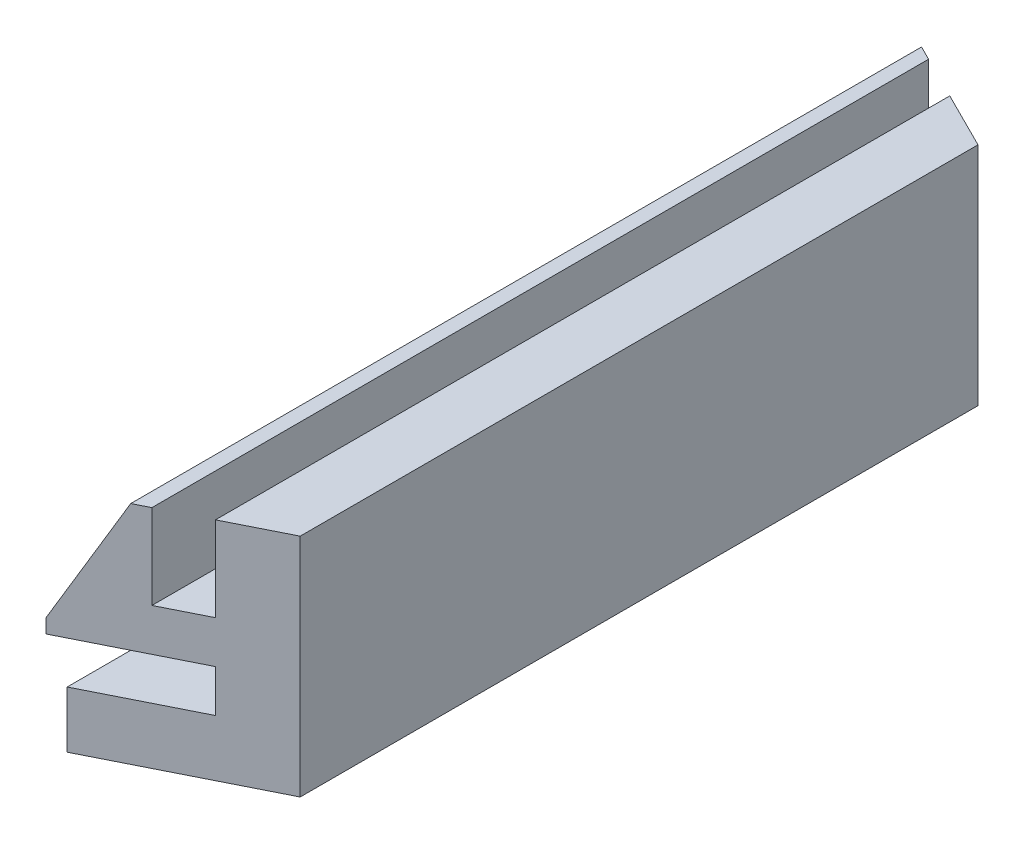
ISO-10303-21;
HEADER;
FILE_DESCRIPTION(('STEP AP214'),'2;1');
FILE_NAME('part.step','',(''),(''),'','','');
FILE_SCHEMA(('AUTOMOTIVE_DESIGN { 1 0 10303 214 1 1 1 1 }'));
ENDSEC;
DATA;
#1=APPLICATION_CONTEXT('core data for automotive mechanical design processes');
#2=APPLICATION_PROTOCOL_DEFINITION('international standard','automotive_design',2000,#1);
#3=PRODUCT_CONTEXT('',#1,'mechanical');
#4=PRODUCT('Part','Part','',(#3));
#5=PRODUCT_RELATED_PRODUCT_CATEGORY('part','',(#4));
#6=PRODUCT_DEFINITION_FORMATION('','',#4);
#7=PRODUCT_DEFINITION_CONTEXT('part definition',#1,'design');
#8=PRODUCT_DEFINITION('design','',#6,#7);
#9=PRODUCT_DEFINITION_SHAPE('','',#8);
#10=(LENGTH_UNIT() NAMED_UNIT(*) SI_UNIT(.MILLI.,.METRE.));
#11=(NAMED_UNIT(*) PLANE_ANGLE_UNIT() SI_UNIT($,.RADIAN.));
#12=(NAMED_UNIT(*) SI_UNIT($,.STERADIAN.) SOLID_ANGLE_UNIT());
#13=UNCERTAINTY_MEASURE_WITH_UNIT(LENGTH_MEASURE(1.E-05),#10,'distance_accuracy_value','');
#14=(GEOMETRIC_REPRESENTATION_CONTEXT(3) GLOBAL_UNCERTAINTY_ASSIGNED_CONTEXT((#13)) GLOBAL_UNIT_ASSIGNED_CONTEXT((#10,
#11,#12)) REPRESENTATION_CONTEXT('',''));
#15=CARTESIAN_POINT('',(0.,0.,0.));
#16=DIRECTION('',(0.,0.,1.));
#17=DIRECTION('',(1.,0.,0.));
#18=AXIS2_PLACEMENT_3D('',#15,#16,#17);
#19=CARTESIAN_POINT('',(24.0957258346277,-4.00000000000002,48.1810473352916));
#20=DIRECTION('',(0.447290848418714,0.,0.894388560370081));
#21=DIRECTION('',(0.894388560370081,0.,-0.447290848418714));
#22=AXIS2_PLACEMENT_3D('',#19,#20,#21);
#23=PLANE('',#22);
#24=DIRECTION('',(0.894388560370081,0.,-0.447290848418714));
#25=VECTOR('',#24,1.);
#26=CARTESIAN_POINT('',(24.0957258346277,12.,48.1810473352916));
#27=LINE('',#26,#25);
#28=CARTESIAN_POINT('',(0.,12.,60.2315118977807));
#29=VERTEX_POINT('',#28);
#30=CARTESIAN_POINT('',(4.,12.,58.2310800128576));
#31=VERTEX_POINT('',#30);
#32=EDGE_CURVE('E246',#29,#31,#27,.T.);
#33=ORIENTED_EDGE('',*,*,#32,.F.);
#34=DIRECTION('',(0.,-1.,0.));
#35=VECTOR('',#34,1.);
#36=CARTESIAN_POINT('',(0.,12.,60.2315118977807));
#37=LINE('',#36,#35);
#38=CARTESIAN_POINT('',(0.,6.,60.2315118977807));
#39=VERTEX_POINT('',#38);
#40=EDGE_CURVE('E243',#29,#39,#37,.T.);
#41=ORIENTED_EDGE('',*,*,#40,.T.);
#42=DIRECTION('',(-0.894388560370081,0.,0.447290848418714));
#43=VECTOR('',#42,1.);
#44=CARTESIAN_POINT('',(-3.90790142424717,6.,62.1858845508309));
#45=LINE('',#44,#43);
#46=CARTESIAN_POINT('',(-3.,6.,61.7318358114731));
#47=VERTEX_POINT('',#46);
#48=EDGE_CURVE('E275',#39,#47,#45,.T.);
#49=ORIENTED_EDGE('',*,*,#48,.T.);
#50=DIRECTION('',(0.,1.,0.));
#51=VECTOR('',#50,1.);
#52=CARTESIAN_POINT('',(-3.,6.,61.7318358114731));
#53=LINE('',#52,#51);
#54=CARTESIAN_POINT('',(-3.,12.,61.7318358114731));
#55=VERTEX_POINT('',#54);
#56=EDGE_CURVE('E271',#47,#55,#53,.T.);
#57=ORIENTED_EDGE('',*,*,#56,.T.);
#58=CARTESIAN_POINT('',(-4.,12.,62.2319437827039));
#59=VERTEX_POINT('',#58);
#60=EDGE_CURVE('E169',#59,#55,#27,.T.);
#61=ORIENTED_EDGE('',*,*,#60,.F.);
#62=DIRECTION('',(-0.436431292198721,-0.872862584397441,0.218262768123137));
#63=VECTOR('',#62,1.);
#64=CARTESIAN_POINT('',(-4.73995941567306,10.5200811686539,62.6020033848693));
#65=LINE('',#64,#63);
#66=CARTESIAN_POINT('',(-8.,4.,64.2323756676271));
#67=VERTEX_POINT('',#66);
#68=EDGE_CURVE('E268',#59,#67,#65,.T.);
#69=ORIENTED_EDGE('',*,*,#68,.T.);
#70=DIRECTION('',(0.,1.,0.));
#71=VECTOR('',#70,1.);
#72=CARTESIAN_POINT('',(-8.,-4.00000000000001,64.2323756676271));
#73=LINE('',#72,#71);
#74=CARTESIAN_POINT('',(-8.,3.,64.2323756676271));
#75=VERTEX_POINT('',#74);
#76=EDGE_CURVE('E196',#75,#67,#73,.T.);
#77=ORIENTED_EDGE('',*,*,#76,.F.);
#78=DIRECTION('',(0.894388560370081,0.,-0.447290848418714));
#79=VECTOR('',#78,1.);
#80=CARTESIAN_POINT('',(-3.90790142424717,3.,62.1858845508309));
#81=LINE('',#80,#79);
#82=CARTESIAN_POINT('',(0.,3.,60.2315118977807));
#83=VERTEX_POINT('',#82);
#84=EDGE_CURVE('E56',#75,#83,#81,.T.);
#85=ORIENTED_EDGE('',*,*,#84,.T.);
#86=DIRECTION('',(0.,-1.,0.));
#87=VECTOR('',#86,1.);
#88=CARTESIAN_POINT('',(0.,0.,60.2315118977807));
#89=LINE('',#88,#87);
#90=CARTESIAN_POINT('',(0.,0.,60.2315118977807));
#91=VERTEX_POINT('',#90);
#92=EDGE_CURVE('E157',#83,#91,#89,.T.);
#93=ORIENTED_EDGE('',*,*,#92,.T.);
#94=DIRECTION('',(-0.894388560370081,0.,0.447290848418714));
#95=VECTOR('',#94,1.);
#96=CARTESIAN_POINT('',(-3.90790142424717,0.,62.1858845508309));
#97=LINE('',#96,#95);
#98=CARTESIAN_POINT('',(-7.,0.,63.7322676963963));
#99=VERTEX_POINT('',#98);
#100=EDGE_CURVE('E63',#91,#99,#97,.T.);
#101=ORIENTED_EDGE('',*,*,#100,.T.);
#102=DIRECTION('',(0.,-1.,0.));
#103=VECTOR('',#102,1.);
#104=CARTESIAN_POINT('',(-7.,0.,63.7322676963963));
#105=LINE('',#104,#103);
#106=CARTESIAN_POINT('',(-7.,-4.,63.7322676963963));
#107=VERTEX_POINT('',#106);
#108=EDGE_CURVE('E71',#99,#107,#105,.T.);
#109=ORIENTED_EDGE('',*,*,#108,.T.);
#110=DIRECTION('',(0.894388560370081,0.,-0.447290848418714));
#111=VECTOR('',#110,1.);
#112=CARTESIAN_POINT('',(24.0957258346277,-4.00000000000002,48.1810473352916));
#113=LINE('',#112,#111);
#114=CARTESIAN_POINT('',(4.,-4.,58.2310800128576));
#115=VERTEX_POINT('',#114);
#116=EDGE_CURVE('E168',#107,#115,#113,.T.);
#117=ORIENTED_EDGE('',*,*,#116,.T.);
#118=DIRECTION('',(0.,1.,0.));
#119=VECTOR('',#118,1.);
#120=CARTESIAN_POINT('',(3.99999999999999,-4.00000000000001,58.2310800128576));
#121=LINE('',#120,#119);
#122=EDGE_CURVE('E158',#115,#31,#121,.T.);
#123=ORIENTED_EDGE('',*,*,#122,.T.);
#124=EDGE_LOOP('',(#33,#41,#49,#57,#61,#69,#77,#85,#93,#101,#109,#117,#123));
#125=FACE_BOUND('',#124,.T.);
#126=ADVANCED_FACE('F47',(#125),#23,.T.);
#127=CARTESIAN_POINT('',(0.,0.,70.));
#128=DIRECTION('',(1.,0.,0.));
#129=DIRECTION('',(0.,0.,-1.));
#130=AXIS2_PLACEMENT_3D('',#127,#128,#129);
#131=PLANE('',#130);
#132=DIRECTION('',(0.,0.,-1.));
#133=VECTOR('',#132,1.);
#134=CARTESIAN_POINT('',(0.,3.,70.));
#135=LINE('',#134,#133);
#136=CARTESIAN_POINT('',(0.,3.,8.23064812793438));
#137=VERTEX_POINT('',#136);
#138=EDGE_CURVE('E203',#83,#137,#135,.T.);
#139=ORIENTED_EDGE('',*,*,#138,.T.);
#140=DIRECTION('',(0.,-1.,0.));
#141=VECTOR('',#140,1.);
#142=CARTESIAN_POINT('',(0.,0.,8.23064812793436));
#143=LINE('',#142,#141);
#144=CARTESIAN_POINT('',(0.,0.,8.23064812793436));
#145=VERTEX_POINT('',#144);
#146=EDGE_CURVE('E280',#137,#145,#143,.T.);
#147=ORIENTED_EDGE('',*,*,#146,.T.);
#148=DIRECTION('',(0.,0.,-1.));
#149=VECTOR('',#148,1.);
#150=CARTESIAN_POINT('',(0.,0.,70.));
#151=LINE('',#150,#149);
#152=EDGE_CURVE('E186',#91,#145,#151,.T.);
#153=ORIENTED_EDGE('',*,*,#152,.F.);
#154=ORIENTED_EDGE('',*,*,#92,.F.);
#155=EDGE_LOOP('',(#139,#147,#153,#154));
#156=FACE_BOUND('',#155,.T.);
#157=ADVANCED_FACE('F49',(#156),#131,.F.);
#158=CARTESIAN_POINT('',(0.,0.,70.));
#159=DIRECTION('',(0.,-1.,0.));
#160=DIRECTION('',(1.,0.,0.));
#161=AXIS2_PLACEMENT_3D('',#158,#159,#160);
#162=PLANE('',#161);
#163=ORIENTED_EDGE('',*,*,#152,.T.);
#164=DIRECTION('',(-0.894388560370082,0.,-0.447290848418714));
#165=VECTOR('',#164,1.);
#166=CARTESIAN_POINT('',(24.7109415121087,0.,20.5887869547579));
#167=LINE('',#166,#165);
#168=CARTESIAN_POINT('',(-7.,0.,4.72989232931879));
#169=VERTEX_POINT('',#168);
#170=EDGE_CURVE('E284',#145,#169,#167,.T.);
#171=ORIENTED_EDGE('',*,*,#170,.T.);
#172=DIRECTION('',(0.,0.,-1.));
#173=VECTOR('',#172,1.);
#174=CARTESIAN_POINT('',(-7.,0.,70.));
#175=LINE('',#174,#173);
#176=EDGE_CURVE('E178',#99,#169,#175,.T.);
#177=ORIENTED_EDGE('',*,*,#176,.F.);
#178=ORIENTED_EDGE('',*,*,#100,.F.);
#179=EDGE_LOOP('',(#163,#171,#177,#178));
#180=FACE_BOUND('',#179,.T.);
#181=ADVANCED_FACE('F305',(#180),#162,.F.);
#182=CARTESIAN_POINT('',(-7.,0.,70.));
#183=DIRECTION('',(1.,0.,0.));
#184=DIRECTION('',(0.,0.,-1.));
#185=AXIS2_PLACEMENT_3D('',#182,#183,#184);
#186=PLANE('',#185);
#187=ORIENTED_EDGE('',*,*,#176,.T.);
#188=DIRECTION('',(0.,-1.,0.));
#189=VECTOR('',#188,1.);
#190=CARTESIAN_POINT('',(-7.,0.,4.72989232931879));
#191=LINE('',#190,#189);
#192=CARTESIAN_POINT('',(-6.99999999999999,-4.00000000000001,4.72989232931879));
#193=VERTEX_POINT('',#192);
#194=EDGE_CURVE('E288',#169,#193,#191,.T.);
#195=ORIENTED_EDGE('',*,*,#194,.T.);
#196=DIRECTION('',(0.,0.,-1.));
#197=VECTOR('',#196,1.);
#198=CARTESIAN_POINT('',(-7.,-4.,70.));
#199=LINE('',#198,#197);
#200=EDGE_CURVE('E166',#107,#193,#199,.T.);
#201=ORIENTED_EDGE('',*,*,#200,.F.);
#202=ORIENTED_EDGE('',*,*,#108,.F.);
#203=EDGE_LOOP('',(#187,#195,#201,#202));
#204=FACE_BOUND('',#203,.T.);
#205=ADVANCED_FACE('F304',(#204),#186,.F.);
#206=CARTESIAN_POINT('',(-0.506849315068505,-4.,70.));
#207=DIRECTION('',(0.,1.,0.));
#208=DIRECTION('',(-1.,0.,0.));
#209=AXIS2_PLACEMENT_3D('',#206,#207,#208);
#210=PLANE('',#209);
#211=ORIENTED_EDGE('',*,*,#200,.T.);
#212=DIRECTION('',(0.894388560370082,0.,0.447290848418714));
#213=VECTOR('',#212,1.);
#214=CARTESIAN_POINT('',(-3.29268574676614,-4.00000000000001,6.58394973921859));
#215=LINE('',#214,#213);
#216=CARTESIAN_POINT('',(3.99999999999999,-4.00000000000001,10.2310800128575));
#217=VERTEX_POINT('',#216);
#218=EDGE_CURVE('E148',#193,#217,#215,.T.);
#219=ORIENTED_EDGE('',*,*,#218,.T.);
#220=DIRECTION('',(0.,0.,-1.));
#221=VECTOR('',#220,1.);
#222=CARTESIAN_POINT('',(4.,-4.,70.));
#223=LINE('',#222,#221);
#224=EDGE_CURVE('E164',#115,#217,#223,.T.);
#225=ORIENTED_EDGE('',*,*,#224,.F.);
#226=ORIENTED_EDGE('',*,*,#116,.F.);
#227=EDGE_LOOP('',(#211,#219,#225,#226));
#228=FACE_BOUND('',#227,.T.);
#229=ADVANCED_FACE('F163',(#228),#210,.F.);
#230=CARTESIAN_POINT('',(4.,-4.,70.));
#231=DIRECTION('',(-1.,0.,0.));
#232=DIRECTION('',(0.,0.,1.));
#233=AXIS2_PLACEMENT_3D('',#230,#231,#232);
#234=PLANE('',#233);
#235=ORIENTED_EDGE('',*,*,#224,.T.);
#236=DIRECTION('',(0.,1.,0.));
#237=VECTOR('',#236,1.);
#238=CARTESIAN_POINT('',(3.99999999999999,-4.00000000000001,10.2310800128575));
#239=LINE('',#238,#237);
#240=CARTESIAN_POINT('',(4.,12.,10.2310800128575));
#241=VERTEX_POINT('',#240);
#242=EDGE_CURVE('E145',#217,#241,#239,.T.);
#243=ORIENTED_EDGE('',*,*,#242,.T.);
#244=DIRECTION('',(0.,0.,-1.));
#245=VECTOR('',#244,1.);
#246=CARTESIAN_POINT('',(4.,12.,70.));
#247=LINE('',#246,#245);
#248=EDGE_CURVE('E174',#31,#241,#247,.T.);
#249=ORIENTED_EDGE('',*,*,#248,.F.);
#250=ORIENTED_EDGE('',*,*,#122,.F.);
#251=EDGE_LOOP('',(#235,#243,#249,#250));
#252=FACE_BOUND('',#251,.T.);
#253=ADVANCED_FACE('F171',(#252),#234,.F.);
#254=CARTESIAN_POINT('',(4.,12.,70.));
#255=DIRECTION('',(0.,-1.,0.));
#256=DIRECTION('',(1.,0.,0.));
#257=AXIS2_PLACEMENT_3D('',#254,#255,#256);
#258=PLANE('',#257);
#259=ORIENTED_EDGE('',*,*,#248,.T.);
#260=DIRECTION('',(0.894388560370082,0.,0.447290848418714));
#261=VECTOR('',#260,1.);
#262=CARTESIAN_POINT('',(-3.29268574676613,12.,6.58394973921859));
#263=LINE('',#262,#261);
#264=CARTESIAN_POINT('',(0.,12.,8.23064812793436));
#265=VERTEX_POINT('',#264);
#266=EDGE_CURVE('E151',#265,#241,#263,.T.);
#267=ORIENTED_EDGE('',*,*,#266,.F.);
#268=DIRECTION('',(0.,0.,-1.));
#269=VECTOR('',#268,1.);
#270=CARTESIAN_POINT('',(0.,12.,70.));
#271=LINE('',#270,#269);
#272=EDGE_CURVE('E180',#29,#265,#271,.T.);
#273=ORIENTED_EDGE('',*,*,#272,.F.);
#274=ORIENTED_EDGE('',*,*,#32,.T.);
#275=EDGE_LOOP('',(#259,#267,#273,#274));
#276=FACE_BOUND('',#275,.T.);
#277=ADVANCED_FACE('F245',(#276),#258,.F.);
#278=CARTESIAN_POINT('',(0.,12.,70.));
#279=DIRECTION('',(1.,0.,0.));
#280=DIRECTION('',(0.,1.,0.));
#281=AXIS2_PLACEMENT_3D('',#278,#279,#280);
#282=PLANE('',#281);
#283=ORIENTED_EDGE('',*,*,#272,.T.);
#284=DIRECTION('',(0.,-1.,0.));
#285=VECTOR('',#284,1.);
#286=CARTESIAN_POINT('',(0.,12.,8.23064812793436));
#287=LINE('',#286,#285);
#288=CARTESIAN_POINT('',(0.,6.,8.23064812793437));
#289=VERTEX_POINT('',#288);
#290=EDGE_CURVE('E217',#265,#289,#287,.T.);
#291=ORIENTED_EDGE('',*,*,#290,.T.);
#292=DIRECTION('',(0.,0.,-1.));
#293=VECTOR('',#292,1.);
#294=CARTESIAN_POINT('',(0.,6.,70.));
#295=LINE('',#294,#293);
#296=EDGE_CURVE('E232',#39,#289,#295,.T.);
#297=ORIENTED_EDGE('',*,*,#296,.F.);
#298=ORIENTED_EDGE('',*,*,#40,.F.);
#299=EDGE_LOOP('',(#283,#291,#297,#298));
#300=FACE_BOUND('',#299,.T.);
#301=ADVANCED_FACE('F240',(#300),#282,.F.);
#302=CARTESIAN_POINT('',(0.,6.,70.));
#303=DIRECTION('',(0.,-1.,0.));
#304=DIRECTION('',(1.,0.,0.));
#305=AXIS2_PLACEMENT_3D('',#302,#303,#304);
#306=PLANE('',#305);
#307=ORIENTED_EDGE('',*,*,#296,.T.);
#308=DIRECTION('',(-0.894388560370082,0.,-0.447290848418714));
#309=VECTOR('',#308,1.);
#310=CARTESIAN_POINT('',(24.7109415121087,5.99999999999999,20.5887869547579));
#311=LINE('',#310,#309);
#312=CARTESIAN_POINT('',(-3.,6.,6.73032421424198));
#313=VERTEX_POINT('',#312);
#314=EDGE_CURVE('E299',#289,#313,#311,.T.);
#315=ORIENTED_EDGE('',*,*,#314,.T.);
#316=DIRECTION('',(0.,0.,-1.));
#317=VECTOR('',#316,1.);
#318=CARTESIAN_POINT('',(-3.,6.,70.));
#319=LINE('',#318,#317);
#320=EDGE_CURVE('E228',#47,#313,#319,.T.);
#321=ORIENTED_EDGE('',*,*,#320,.F.);
#322=ORIENTED_EDGE('',*,*,#48,.F.);
#323=EDGE_LOOP('',(#307,#315,#321,#322));
#324=FACE_BOUND('',#323,.T.);
#325=ADVANCED_FACE('F319',(#324),#306,.F.);
#326=CARTESIAN_POINT('',(-3.,6.,70.));
#327=DIRECTION('',(-1.,0.,0.));
#328=DIRECTION('',(0.,-1.,0.));
#329=AXIS2_PLACEMENT_3D('',#326,#327,#328);
#330=PLANE('',#329);
#331=ORIENTED_EDGE('',*,*,#320,.T.);
#332=DIRECTION('',(0.,1.,0.));
#333=VECTOR('',#332,1.);
#334=CARTESIAN_POINT('',(-3.,5.99999999999999,6.73032421424198));
#335=LINE('',#334,#333);
#336=CARTESIAN_POINT('',(-2.99999999999999,12.,6.73032421424197));
#337=VERTEX_POINT('',#336);
#338=EDGE_CURVE('E295',#313,#337,#335,.T.);
#339=ORIENTED_EDGE('',*,*,#338,.T.);
#340=DIRECTION('',(0.,0.,-1.));
#341=VECTOR('',#340,1.);
#342=CARTESIAN_POINT('',(-3.,12.,70.));
#343=LINE('',#342,#341);
#344=EDGE_CURVE('E224',#55,#337,#343,.T.);
#345=ORIENTED_EDGE('',*,*,#344,.F.);
#346=ORIENTED_EDGE('',*,*,#56,.F.);
#347=EDGE_LOOP('',(#331,#339,#345,#346));
#348=FACE_BOUND('',#347,.T.);
#349=ADVANCED_FACE('F317',(#348),#330,.F.);
#350=CARTESIAN_POINT('',(-3.,12.,70.));
#351=DIRECTION('',(0.,-1.,0.));
#352=DIRECTION('',(0.,0.,-1.));
#353=AXIS2_PLACEMENT_3D('',#350,#351,#352);
#354=PLANE('',#353);
#355=ORIENTED_EDGE('',*,*,#344,.T.);
#356=CARTESIAN_POINT('',(-3.99999999999999,12.,6.23021624301119));
#357=VERTEX_POINT('',#356);
#358=EDGE_CURVE('E249',#357,#337,#263,.T.);
#359=ORIENTED_EDGE('',*,*,#358,.F.);
#360=DIRECTION('',(0.,0.,-1.));
#361=VECTOR('',#360,1.);
#362=CARTESIAN_POINT('',(-4.,12.,70.));
#363=LINE('',#362,#361);
#364=EDGE_CURVE('E215',#59,#357,#363,.T.);
#365=ORIENTED_EDGE('',*,*,#364,.F.);
#366=ORIENTED_EDGE('',*,*,#60,.T.);
#367=EDGE_LOOP('',(#355,#359,#365,#366));
#368=FACE_BOUND('',#367,.T.);
#369=ADVANCED_FACE('F313',(#368),#354,.F.);
#370=CARTESIAN_POINT('',(-4.,12.,70.));
#371=DIRECTION('',(0.894427190999916,-0.447213595499958,0.));
#372=DIRECTION('',(0.447213595499958,0.894427190999916,0.));
#373=AXIS2_PLACEMENT_3D('',#370,#371,#372);
#374=PLANE('',#373);
#375=ORIENTED_EDGE('',*,*,#364,.T.);
#376=DIRECTION('',(-0.436431292198721,-0.872862584397442,-0.218262768123137));
#377=VECTOR('',#376,1.);
#378=CARTESIAN_POINT('',(2.07449928353427,24.1489985670685,9.26812175594242));
#379=LINE('',#378,#377);
#380=CARTESIAN_POINT('',(-8.,4.,4.22978435808799));
#381=VERTEX_POINT('',#380);
#382=EDGE_CURVE('E291',#357,#381,#379,.T.);
#383=ORIENTED_EDGE('',*,*,#382,.T.);
#384=DIRECTION('',(0.,0.,-1.));
#385=VECTOR('',#384,1.);
#386=CARTESIAN_POINT('',(-8.,4.,70.));
#387=LINE('',#386,#385);
#388=EDGE_CURVE('E211',#67,#381,#387,.T.);
#389=ORIENTED_EDGE('',*,*,#388,.F.);
#390=ORIENTED_EDGE('',*,*,#68,.F.);
#391=EDGE_LOOP('',(#375,#383,#389,#390));
#392=FACE_BOUND('',#391,.T.);
#393=ADVANCED_FACE('F309',(#392),#374,.F.);
#394=CARTESIAN_POINT('',(-8.,3.,70.));
#395=DIRECTION('',(1.,0.,0.));
#396=DIRECTION('',(0.,0.,-1.));
#397=AXIS2_PLACEMENT_3D('',#394,#395,#396);
#398=PLANE('',#397);
#399=ORIENTED_EDGE('',*,*,#388,.T.);
#400=DIRECTION('',(0.,1.,0.));
#401=VECTOR('',#400,1.);
#402=CARTESIAN_POINT('',(-8.,-4.00000000000001,4.22978435808799));
#403=LINE('',#402,#401);
#404=CARTESIAN_POINT('',(-8.,3.,4.22978435808799));
#405=VERTEX_POINT('',#404);
#406=EDGE_CURVE('E209',#405,#381,#403,.T.);
#407=ORIENTED_EDGE('',*,*,#406,.F.);
#408=DIRECTION('',(0.,0.,-1.));
#409=VECTOR('',#408,1.);
#410=CARTESIAN_POINT('',(-8.,3.,70.));
#411=LINE('',#410,#409);
#412=EDGE_CURVE('E201',#75,#405,#411,.T.);
#413=ORIENTED_EDGE('',*,*,#412,.F.);
#414=ORIENTED_EDGE('',*,*,#76,.T.);
#415=EDGE_LOOP('',(#399,#407,#413,#414));
#416=FACE_BOUND('',#415,.T.);
#417=ADVANCED_FACE('F207',(#416),#398,.F.);
#418=CARTESIAN_POINT('',(0.,3.,70.));
#419=DIRECTION('',(0.,1.,0.));
#420=DIRECTION('',(-1.,0.,0.));
#421=AXIS2_PLACEMENT_3D('',#418,#419,#420);
#422=PLANE('',#421);
#423=ORIENTED_EDGE('',*,*,#412,.T.);
#424=DIRECTION('',(0.894388560370082,0.,0.447290848418714));
#425=VECTOR('',#424,1.);
#426=CARTESIAN_POINT('',(24.7109415121087,3.,20.5887869547579));
#427=LINE('',#426,#425);
#428=EDGE_CURVE('E11',#405,#137,#427,.T.);
#429=ORIENTED_EDGE('',*,*,#428,.T.);
#430=ORIENTED_EDGE('',*,*,#138,.F.);
#431=ORIENTED_EDGE('',*,*,#84,.F.);
#432=EDGE_LOOP('',(#423,#429,#430,#431));
#433=FACE_BOUND('',#432,.T.);
#434=ADVANCED_FACE('F200',(#433),#422,.F.);
#435=CARTESIAN_POINT('',(-3.29268574676614,-4.00000000000001,6.58394973921859));
#436=DIRECTION('',(-0.447290848418714,0.,0.894388560370082));
#437=DIRECTION('',(0.894388560370082,0.,0.447290848418714));
#438=AXIS2_PLACEMENT_3D('',#435,#436,#437);
#439=PLANE('',#438);
#440=ORIENTED_EDGE('',*,*,#290,.F.);
#441=ORIENTED_EDGE('',*,*,#266,.T.);
#442=ORIENTED_EDGE('',*,*,#242,.F.);
#443=ORIENTED_EDGE('',*,*,#218,.F.);
#444=ORIENTED_EDGE('',*,*,#194,.F.);
#445=ORIENTED_EDGE('',*,*,#170,.F.);
#446=ORIENTED_EDGE('',*,*,#146,.F.);
#447=ORIENTED_EDGE('',*,*,#428,.F.);
#448=ORIENTED_EDGE('',*,*,#406,.T.);
#449=ORIENTED_EDGE('',*,*,#382,.F.);
#450=ORIENTED_EDGE('',*,*,#358,.T.);
#451=ORIENTED_EDGE('',*,*,#338,.F.);
#452=ORIENTED_EDGE('',*,*,#314,.F.);
#453=EDGE_LOOP('',(#440,#441,#442,#443,#444,#445,#446,#447,#448,#449,#450,#451,#452));
#454=FACE_BOUND('',#453,.T.);
#455=ADVANCED_FACE('F147',(#454),#439,.F.);
#456=CLOSED_SHELL('',(#126,#157,#181,#205,#229,#253,#277,#301,#325,#349,#369,#393,#417,#434,#455));
#457=MANIFOLD_SOLID_BREP('B2',#456);
#458=ADVANCED_BREP_SHAPE_REPRESENTATION('',(#18,#457),#14);
#459=SHAPE_DEFINITION_REPRESENTATION(#9,#458);
ENDSEC;
END-ISO-10303-21;
